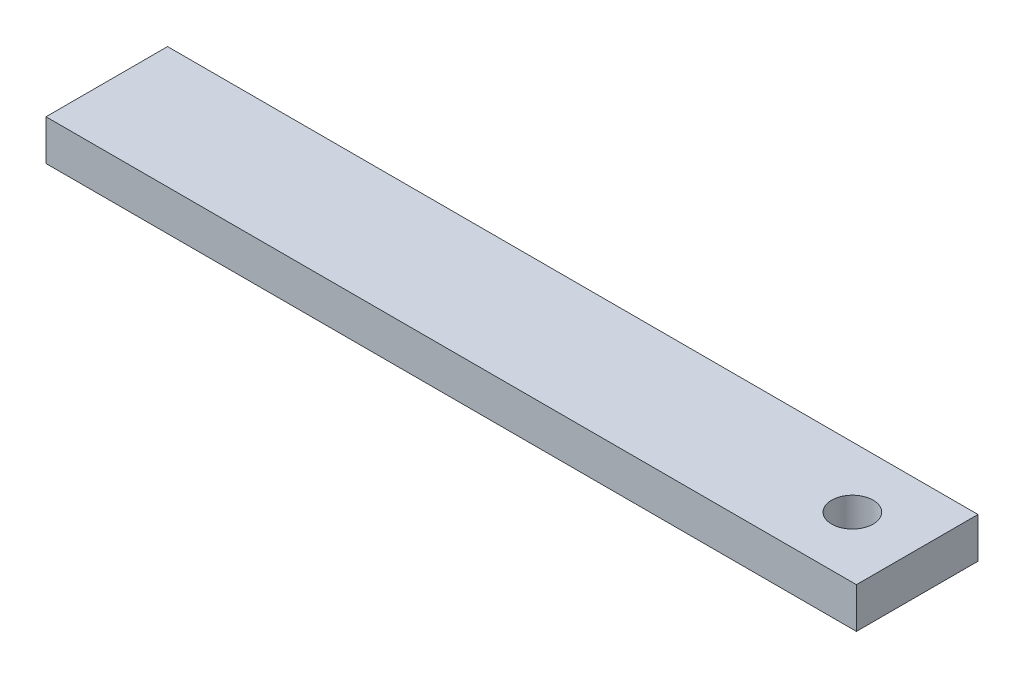
ISO-10303-21;
HEADER;
FILE_DESCRIPTION(('STEP AP214'),'2;1');
FILE_NAME('part.step','',(''),(''),'','','');
FILE_SCHEMA(('AUTOMOTIVE_DESIGN { 1 0 10303 214 1 1 1 1 }'));
ENDSEC;
DATA;
#1=APPLICATION_CONTEXT('core data for automotive mechanical design processes');
#2=APPLICATION_PROTOCOL_DEFINITION('international standard','automotive_design',2000,#1);
#3=PRODUCT_CONTEXT('',#1,'mechanical');
#4=PRODUCT('Part','Part','',(#3));
#5=PRODUCT_RELATED_PRODUCT_CATEGORY('part','',(#4));
#6=PRODUCT_DEFINITION_FORMATION('','',#4);
#7=PRODUCT_DEFINITION_CONTEXT('part definition',#1,'design');
#8=PRODUCT_DEFINITION('design','',#6,#7);
#9=PRODUCT_DEFINITION_SHAPE('','',#8);
#10=(LENGTH_UNIT() NAMED_UNIT(*) SI_UNIT(.MILLI.,.METRE.));
#11=(NAMED_UNIT(*) PLANE_ANGLE_UNIT() SI_UNIT($,.RADIAN.));
#12=(NAMED_UNIT(*) SI_UNIT($,.STERADIAN.) SOLID_ANGLE_UNIT());
#13=UNCERTAINTY_MEASURE_WITH_UNIT(LENGTH_MEASURE(1.E-05),#10,'distance_accuracy_value','');
#14=(GEOMETRIC_REPRESENTATION_CONTEXT(3) GLOBAL_UNCERTAINTY_ASSIGNED_CONTEXT((#13)) GLOBAL_UNIT_ASSIGNED_CONTEXT((#10,
#11,#12)) REPRESENTATION_CONTEXT('',''));
#15=CARTESIAN_POINT('',(0.,0.,0.));
#16=DIRECTION('',(0.,0.,1.));
#17=DIRECTION('',(1.,0.,0.));
#18=AXIS2_PLACEMENT_3D('',#15,#16,#17);
#19=CARTESIAN_POINT('',(100.,10.,15.));
#20=DIRECTION('',(-1.,0.,0.));
#21=DIRECTION('',(0.,0.,1.));
#22=AXIS2_PLACEMENT_3D('',#19,#20,#21);
#23=PLANE('',#22);
#24=DIRECTION('',(0.,0.,-1.));
#25=VECTOR('',#24,1.);
#26=CARTESIAN_POINT('',(100.,0.,15.));
#27=LINE('',#26,#25);
#28=CARTESIAN_POINT('',(100.,0.,15.));
#29=VERTEX_POINT('',#28);
#30=CARTESIAN_POINT('',(100.,0.,-15.));
#31=VERTEX_POINT('',#30);
#32=EDGE_CURVE('E96',#29,#31,#27,.T.);
#33=ORIENTED_EDGE('',*,*,#32,.T.);
#34=DIRECTION('',(0.,-1.,0.));
#35=VECTOR('',#34,1.);
#36=CARTESIAN_POINT('',(100.,10.,-15.));
#37=LINE('',#36,#35);
#38=CARTESIAN_POINT('',(100.,10.,-15.));
#39=VERTEX_POINT('',#38);
#40=EDGE_CURVE('E11',#39,#31,#37,.T.);
#41=ORIENTED_EDGE('',*,*,#40,.F.);
#42=DIRECTION('',(0.,0.,-1.));
#43=VECTOR('',#42,1.);
#44=CARTESIAN_POINT('',(100.,10.,15.));
#45=LINE('',#44,#43);
#46=CARTESIAN_POINT('',(100.,10.,15.));
#47=VERTEX_POINT('',#46);
#48=EDGE_CURVE('E84',#47,#39,#45,.T.);
#49=ORIENTED_EDGE('',*,*,#48,.F.);
#50=DIRECTION('',(0.,-1.,0.));
#51=VECTOR('',#50,1.);
#52=CARTESIAN_POINT('',(100.,10.,15.));
#53=LINE('',#52,#51);
#54=EDGE_CURVE('E92',#47,#29,#53,.T.);
#55=ORIENTED_EDGE('',*,*,#54,.T.);
#56=EDGE_LOOP('',(#33,#41,#49,#55));
#57=FACE_BOUND('',#56,.T.);
#58=ADVANCED_FACE('F33',(#57),#23,.F.);
#59=CARTESIAN_POINT('',(-100.,10.,-15.));
#60=DIRECTION('',(0.,0.,1.));
#61=DIRECTION('',(1.,0.,0.));
#62=AXIS2_PLACEMENT_3D('',#59,#60,#61);
#63=PLANE('',#62);
#64=DIRECTION('',(-1.,0.,0.));
#65=VECTOR('',#64,1.);
#66=CARTESIAN_POINT('',(-100.,0.,-15.));
#67=LINE('',#66,#65);
#68=CARTESIAN_POINT('',(-100.,0.,-15.));
#69=VERTEX_POINT('',#68);
#70=EDGE_CURVE('E88',#31,#69,#67,.T.);
#71=ORIENTED_EDGE('',*,*,#70,.T.);
#72=DIRECTION('',(0.,-1.,0.));
#73=VECTOR('',#72,1.);
#74=CARTESIAN_POINT('',(-100.,10.,-15.));
#75=LINE('',#74,#73);
#76=CARTESIAN_POINT('',(-100.,10.,-15.));
#77=VERTEX_POINT('',#76);
#78=EDGE_CURVE('E41',#77,#69,#75,.T.);
#79=ORIENTED_EDGE('',*,*,#78,.F.);
#80=DIRECTION('',(-1.,0.,0.));
#81=VECTOR('',#80,1.);
#82=CARTESIAN_POINT('',(-100.,10.,-15.));
#83=LINE('',#82,#81);
#84=EDGE_CURVE('E79',#39,#77,#83,.T.);
#85=ORIENTED_EDGE('',*,*,#84,.F.);
#86=ORIENTED_EDGE('',*,*,#40,.T.);
#87=EDGE_LOOP('',(#71,#79,#85,#86));
#88=FACE_BOUND('',#87,.T.);
#89=ADVANCED_FACE('F87',(#88),#63,.F.);
#90=CARTESIAN_POINT('',(-100.,10.,15.));
#91=DIRECTION('',(1.,0.,0.));
#92=DIRECTION('',(0.,0.,-1.));
#93=AXIS2_PLACEMENT_3D('',#90,#91,#92);
#94=PLANE('',#93);
#95=DIRECTION('',(0.,0.,1.));
#96=VECTOR('',#95,1.);
#97=CARTESIAN_POINT('',(-100.,0.,15.));
#98=LINE('',#97,#96);
#99=CARTESIAN_POINT('',(-100.,0.,15.));
#100=VERTEX_POINT('',#99);
#101=EDGE_CURVE('E66',#69,#100,#98,.T.);
#102=ORIENTED_EDGE('',*,*,#101,.T.);
#103=DIRECTION('',(0.,-1.,0.));
#104=VECTOR('',#103,1.);
#105=CARTESIAN_POINT('',(-100.,10.,15.));
#106=LINE('',#105,#104);
#107=CARTESIAN_POINT('',(-100.,10.,15.));
#108=VERTEX_POINT('',#107);
#109=EDGE_CURVE('E89',#108,#100,#106,.T.);
#110=ORIENTED_EDGE('',*,*,#109,.F.);
#111=DIRECTION('',(0.,0.,1.));
#112=VECTOR('',#111,1.);
#113=CARTESIAN_POINT('',(-100.,10.,15.));
#114=LINE('',#113,#112);
#115=EDGE_CURVE('E82',#77,#108,#114,.T.);
#116=ORIENTED_EDGE('',*,*,#115,.F.);
#117=ORIENTED_EDGE('',*,*,#78,.T.);
#118=EDGE_LOOP('',(#102,#110,#116,#117));
#119=FACE_BOUND('',#118,.T.);
#120=ADVANCED_FACE('F90',(#119),#94,.F.);
#121=CARTESIAN_POINT('',(-100.,10.,15.));
#122=DIRECTION('',(0.,0.,-1.));
#123=DIRECTION('',(-1.,0.,0.));
#124=AXIS2_PLACEMENT_3D('',#121,#122,#123);
#125=PLANE('',#124);
#126=DIRECTION('',(1.,0.,0.));
#127=VECTOR('',#126,1.);
#128=CARTESIAN_POINT('',(-100.,0.,15.));
#129=LINE('',#128,#127);
#130=EDGE_CURVE('E72',#100,#29,#129,.T.);
#131=ORIENTED_EDGE('',*,*,#130,.T.);
#132=ORIENTED_EDGE('',*,*,#54,.F.);
#133=DIRECTION('',(1.,0.,0.));
#134=VECTOR('',#133,1.);
#135=CARTESIAN_POINT('',(-100.,10.,15.));
#136=LINE('',#135,#134);
#137=EDGE_CURVE('E49',#108,#47,#136,.T.);
#138=ORIENTED_EDGE('',*,*,#137,.F.);
#139=ORIENTED_EDGE('',*,*,#109,.T.);
#140=EDGE_LOOP('',(#131,#132,#138,#139));
#141=FACE_BOUND('',#140,.T.);
#142=ADVANCED_FACE('F104',(#141),#125,.F.);
#143=CARTESIAN_POINT('',(0.,10.,0.));
#144=DIRECTION('',(0.,-1.,0.));
#145=DIRECTION('',(0.,0.,-1.));
#146=AXIS2_PLACEMENT_3D('',#143,#144,#145);
#147=PLANE('',#146);
#148=CARTESIAN_POINT('',(84.,10.,0.));
#149=DIRECTION('',(0.,1.,0.));
#150=DIRECTION('',(0.,0.,1.));
#151=AXIS2_PLACEMENT_3D('',#148,#149,#150);
#152=CIRCLE('',#151,5.12500000000001);
#153=CARTESIAN_POINT('',(84.,10.,5.12500000000001));
#154=VERTEX_POINT('',#153);
#155=EDGE_CURVE('E110',#154,#154,#152,.T.);
#156=ORIENTED_EDGE('',*,*,#155,.F.);
#157=EDGE_LOOP('',(#156));
#158=FACE_BOUND('',#157,.T.);
#159=ORIENTED_EDGE('',*,*,#48,.T.);
#160=ORIENTED_EDGE('',*,*,#84,.T.);
#161=ORIENTED_EDGE('',*,*,#115,.T.);
#162=ORIENTED_EDGE('',*,*,#137,.T.);
#163=EDGE_LOOP('',(#159,#160,#161,#162));
#164=FACE_BOUND('',#163,.T.);
#165=ADVANCED_FACE('F80',(#158,#164),#147,.F.);
#166=CARTESIAN_POINT('',(0.,0.,0.));
#167=DIRECTION('',(0.,-1.,0.));
#168=DIRECTION('',(0.,0.,-1.));
#169=AXIS2_PLACEMENT_3D('',#166,#167,#168);
#170=PLANE('',#169);
#171=CARTESIAN_POINT('',(84.,0.,0.));
#172=DIRECTION('',(0.,1.,0.));
#173=DIRECTION('',(0.,0.,1.));
#174=AXIS2_PLACEMENT_3D('',#171,#172,#173);
#175=CIRCLE('',#174,5.12500000000001);
#176=CARTESIAN_POINT('',(84.,0.,5.12500000000001));
#177=VERTEX_POINT('',#176);
#178=EDGE_CURVE('E99',#177,#177,#175,.T.);
#179=ORIENTED_EDGE('',*,*,#178,.T.);
#180=EDGE_LOOP('',(#179));
#181=FACE_BOUND('',#180,.T.);
#182=ORIENTED_EDGE('',*,*,#32,.F.);
#183=ORIENTED_EDGE('',*,*,#130,.F.);
#184=ORIENTED_EDGE('',*,*,#101,.F.);
#185=ORIENTED_EDGE('',*,*,#70,.F.);
#186=EDGE_LOOP('',(#182,#183,#184,#185));
#187=FACE_BOUND('',#186,.T.);
#188=ADVANCED_FACE('F107',(#181,#187),#170,.T.);
#189=CARTESIAN_POINT('',(84.,0.,0.));
#190=DIRECTION('',(0.,1.,0.));
#191=DIRECTION('',(0.,0.,1.));
#192=AXIS2_PLACEMENT_3D('',#189,#190,#191);
#193=CYLINDRICAL_SURFACE('',#192,5.12500000000001);
#194=ORIENTED_EDGE('',*,*,#178,.F.);
#195=EDGE_LOOP('',(#194));
#196=FACE_BOUND('',#195,.T.);
#197=ORIENTED_EDGE('',*,*,#155,.T.);
#198=EDGE_LOOP('',(#197));
#199=FACE_BOUND('',#198,.T.);
#200=ADVANCED_FACE('F117',(#196,#199),#193,.F.);
#201=CLOSED_SHELL('',(#58,#89,#120,#142,#165,#188,#200));
#202=MANIFOLD_SOLID_BREP('B2',#201);
#203=ADVANCED_BREP_SHAPE_REPRESENTATION('',(#18,#202),#14);
#204=SHAPE_DEFINITION_REPRESENTATION(#9,#203);
ENDSEC;
END-ISO-10303-21;
